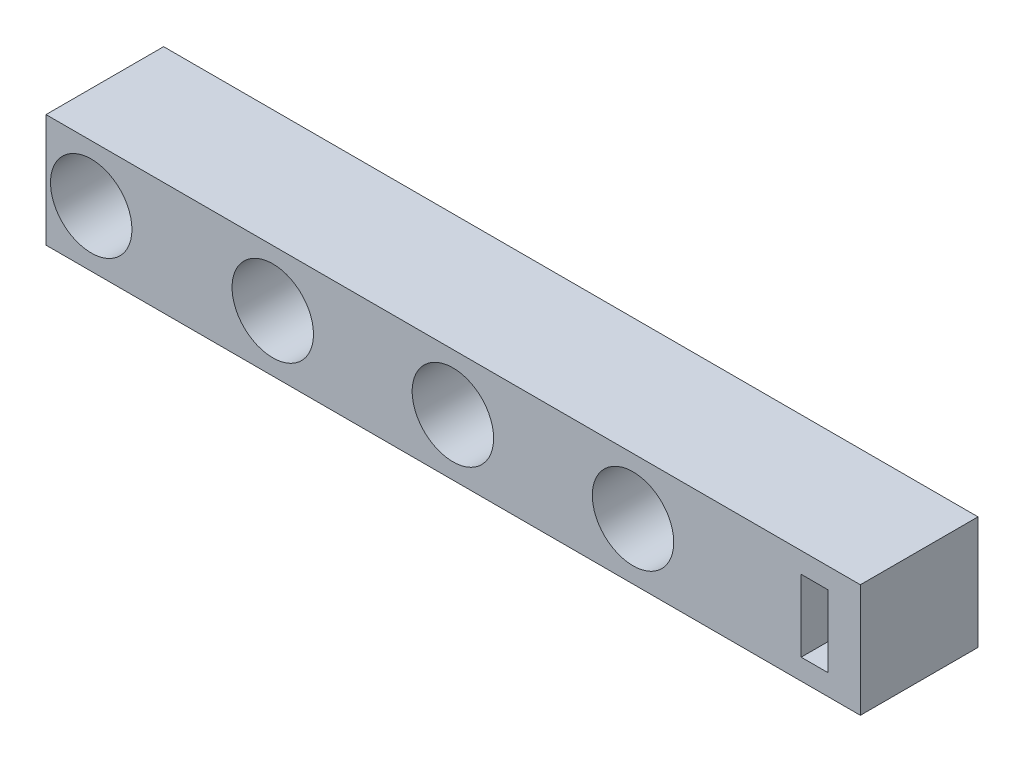
ISO-10303-21;
HEADER;
FILE_DESCRIPTION(('STEP AP214'),'2;1');
FILE_NAME('part.step','',(''),(''),'','','');
FILE_SCHEMA(('AUTOMOTIVE_DESIGN { 1 0 10303 214 1 1 1 1 }'));
ENDSEC;
DATA;
#1=APPLICATION_CONTEXT('core data for automotive mechanical design processes');
#2=APPLICATION_PROTOCOL_DEFINITION('international standard','automotive_design',2000,#1);
#3=PRODUCT_CONTEXT('',#1,'mechanical');
#4=PRODUCT('Part','Part','',(#3));
#5=PRODUCT_RELATED_PRODUCT_CATEGORY('part','',(#4));
#6=PRODUCT_DEFINITION_FORMATION('','',#4);
#7=PRODUCT_DEFINITION_CONTEXT('part definition',#1,'design');
#8=PRODUCT_DEFINITION('design','',#6,#7);
#9=PRODUCT_DEFINITION_SHAPE('','',#8);
#10=(LENGTH_UNIT() NAMED_UNIT(*) SI_UNIT(.MILLI.,.METRE.));
#11=(NAMED_UNIT(*) PLANE_ANGLE_UNIT() SI_UNIT($,.RADIAN.));
#12=(NAMED_UNIT(*) SI_UNIT($,.STERADIAN.) SOLID_ANGLE_UNIT());
#13=UNCERTAINTY_MEASURE_WITH_UNIT(LENGTH_MEASURE(1.E-05),#10,'distance_accuracy_value','');
#14=(GEOMETRIC_REPRESENTATION_CONTEXT(3) GLOBAL_UNCERTAINTY_ASSIGNED_CONTEXT((#13)) GLOBAL_UNIT_ASSIGNED_CONTEXT((#10,
#11,#12)) REPRESENTATION_CONTEXT('',''));
#15=CARTESIAN_POINT('',(0.,0.,0.));
#16=DIRECTION('',(0.,0.,1.));
#17=DIRECTION('',(1.,0.,0.));
#18=AXIS2_PLACEMENT_3D('',#15,#16,#17);
#19=CARTESIAN_POINT('',(0.,0.,26.));
#20=DIRECTION('',(1.,0.,0.));
#21=DIRECTION('',(0.,0.,-1.));
#22=AXIS2_PLACEMENT_3D('',#19,#20,#21);
#23=PLANE('',#22);
#24=DIRECTION('',(0.,-1.,0.));
#25=VECTOR('',#24,1.);
#26=CARTESIAN_POINT('',(0.,0.,0.));
#27=LINE('',#26,#25);
#28=CARTESIAN_POINT('',(0.,25.,0.));
#29=VERTEX_POINT('',#28);
#30=CARTESIAN_POINT('',(0.,0.,0.));
#31=VERTEX_POINT('',#30);
#32=EDGE_CURVE('E157',#29,#31,#27,.T.);
#33=ORIENTED_EDGE('',*,*,#32,.T.);
#34=DIRECTION('',(0.,0.,-1.));
#35=VECTOR('',#34,1.);
#36=CARTESIAN_POINT('',(0.,0.,26.));
#37=LINE('',#36,#35);
#38=CARTESIAN_POINT('',(0.,0.,26.));
#39=VERTEX_POINT('',#38);
#40=EDGE_CURVE('E11',#39,#31,#37,.T.);
#41=ORIENTED_EDGE('',*,*,#40,.F.);
#42=DIRECTION('',(0.,-1.,0.));
#43=VECTOR('',#42,1.);
#44=CARTESIAN_POINT('',(0.,0.,26.));
#45=LINE('',#44,#43);
#46=CARTESIAN_POINT('',(0.,25.,26.));
#47=VERTEX_POINT('',#46);
#48=EDGE_CURVE('E158',#47,#39,#45,.T.);
#49=ORIENTED_EDGE('',*,*,#48,.F.);
#50=DIRECTION('',(0.,0.,-1.));
#51=VECTOR('',#50,1.);
#52=CARTESIAN_POINT('',(0.,25.,26.));
#53=LINE('',#52,#51);
#54=EDGE_CURVE('E168',#47,#29,#53,.T.);
#55=ORIENTED_EDGE('',*,*,#54,.T.);
#56=EDGE_LOOP('',(#33,#41,#49,#55));
#57=FACE_BOUND('',#56,.T.);
#58=ADVANCED_FACE('F33',(#57),#23,.F.);
#59=CARTESIAN_POINT('',(0.,0.,26.));
#60=DIRECTION('',(0.,1.,0.));
#61=DIRECTION('',(0.,0.,1.));
#62=AXIS2_PLACEMENT_3D('',#59,#60,#61);
#63=PLANE('',#62);
#64=DIRECTION('',(1.,0.,0.));
#65=VECTOR('',#64,1.);
#66=CARTESIAN_POINT('',(0.,0.,0.));
#67=LINE('',#66,#65);
#68=CARTESIAN_POINT('',(180.,0.,0.));
#69=VERTEX_POINT('',#68);
#70=EDGE_CURVE('E171',#31,#69,#67,.T.);
#71=ORIENTED_EDGE('',*,*,#70,.T.);
#72=DIRECTION('',(0.,0.,-1.));
#73=VECTOR('',#72,1.);
#74=CARTESIAN_POINT('',(180.,0.,26.));
#75=LINE('',#74,#73);
#76=CARTESIAN_POINT('',(180.,0.,26.));
#77=VERTEX_POINT('',#76);
#78=EDGE_CURVE('E40',#77,#69,#75,.T.);
#79=ORIENTED_EDGE('',*,*,#78,.F.);
#80=DIRECTION('',(1.,0.,0.));
#81=VECTOR('',#80,1.);
#82=CARTESIAN_POINT('',(0.,0.,26.));
#83=LINE('',#82,#81);
#84=EDGE_CURVE('E161',#39,#77,#83,.T.);
#85=ORIENTED_EDGE('',*,*,#84,.F.);
#86=ORIENTED_EDGE('',*,*,#40,.T.);
#87=EDGE_LOOP('',(#71,#79,#85,#86));
#88=FACE_BOUND('',#87,.T.);
#89=ADVANCED_FACE('F200',(#88),#63,.F.);
#90=CARTESIAN_POINT('',(180.,0.,26.));
#91=DIRECTION('',(-1.,0.,0.));
#92=DIRECTION('',(0.,0.,1.));
#93=AXIS2_PLACEMENT_3D('',#90,#91,#92);
#94=PLANE('',#93);
#95=DIRECTION('',(0.,1.,0.));
#96=VECTOR('',#95,1.);
#97=CARTESIAN_POINT('',(180.,0.,0.));
#98=LINE('',#97,#96);
#99=CARTESIAN_POINT('',(180.,25.,0.));
#100=VERTEX_POINT('',#99);
#101=EDGE_CURVE('E173',#69,#100,#98,.T.);
#102=ORIENTED_EDGE('',*,*,#101,.T.);
#103=DIRECTION('',(0.,0.,-1.));
#104=VECTOR('',#103,1.);
#105=CARTESIAN_POINT('',(180.,25.,26.));
#106=LINE('',#105,#104);
#107=CARTESIAN_POINT('',(180.,25.,26.));
#108=VERTEX_POINT('',#107);
#109=EDGE_CURVE('E178',#108,#100,#106,.T.);
#110=ORIENTED_EDGE('',*,*,#109,.F.);
#111=DIRECTION('',(0.,1.,0.));
#112=VECTOR('',#111,1.);
#113=CARTESIAN_POINT('',(180.,0.,26.));
#114=LINE('',#113,#112);
#115=EDGE_CURVE('E164',#77,#108,#114,.T.);
#116=ORIENTED_EDGE('',*,*,#115,.F.);
#117=ORIENTED_EDGE('',*,*,#78,.T.);
#118=EDGE_LOOP('',(#102,#110,#116,#117));
#119=FACE_BOUND('',#118,.T.);
#120=ADVANCED_FACE('F185',(#119),#94,.F.);
#121=CARTESIAN_POINT('',(0.,25.,26.));
#122=DIRECTION('',(0.,-1.,0.));
#123=DIRECTION('',(0.,0.,-1.));
#124=AXIS2_PLACEMENT_3D('',#121,#122,#123);
#125=PLANE('',#124);
#126=DIRECTION('',(-1.,0.,0.));
#127=VECTOR('',#126,1.);
#128=CARTESIAN_POINT('',(0.,25.,0.));
#129=LINE('',#128,#127);
#130=EDGE_CURVE('E162',#100,#29,#129,.T.);
#131=ORIENTED_EDGE('',*,*,#130,.T.);
#132=ORIENTED_EDGE('',*,*,#54,.F.);
#133=DIRECTION('',(-1.,0.,0.));
#134=VECTOR('',#133,1.);
#135=CARTESIAN_POINT('',(0.,25.,26.));
#136=LINE('',#135,#134);
#137=EDGE_CURVE('E166',#108,#47,#136,.T.);
#138=ORIENTED_EDGE('',*,*,#137,.F.);
#139=ORIENTED_EDGE('',*,*,#109,.T.);
#140=EDGE_LOOP('',(#131,#132,#138,#139));
#141=FACE_BOUND('',#140,.T.);
#142=ADVANCED_FACE('F193',(#141),#125,.F.);
#143=CARTESIAN_POINT('',(0.,0.,26.));
#144=DIRECTION('',(0.,0.,-1.));
#145=DIRECTION('',(-1.,0.,0.));
#146=AXIS2_PLACEMENT_3D('',#143,#144,#145);
#147=PLANE('',#146);
#148=DIRECTION('',(-1.,0.,0.));
#149=VECTOR('',#148,1.);
#150=CARTESIAN_POINT('',(172.810723890188,20.4582947622352,26.));
#151=LINE('',#150,#149);
#152=CARTESIAN_POINT('',(172.810723890188,20.4582947622352,26.));
#153=VERTEX_POINT('',#152);
#154=CARTESIAN_POINT('',(166.913142675889,20.4582947622352,26.));
#155=VERTEX_POINT('',#154);
#156=EDGE_CURVE('E124',#153,#155,#151,.T.);
#157=ORIENTED_EDGE('',*,*,#156,.F.);
#158=DIRECTION('',(0.,1.,0.));
#159=VECTOR('',#158,1.);
#160=CARTESIAN_POINT('',(172.810723890188,20.4582947622352,26.));
#161=LINE('',#160,#159);
#162=CARTESIAN_POINT('',(172.810723890188,4.59099292376435,26.));
#163=VERTEX_POINT('',#162);
#164=EDGE_CURVE('E47',#163,#153,#161,.T.);
#165=ORIENTED_EDGE('',*,*,#164,.F.);
#166=DIRECTION('',(1.,0.,0.));
#167=VECTOR('',#166,1.);
#168=CARTESIAN_POINT('',(172.810723890188,4.59099292376435,26.));
#169=LINE('',#168,#167);
#170=CARTESIAN_POINT('',(166.913142675889,4.59099292376435,26.));
#171=VERTEX_POINT('',#170);
#172=EDGE_CURVE('E115',#171,#163,#169,.T.);
#173=ORIENTED_EDGE('',*,*,#172,.F.);
#174=DIRECTION('',(0.,-1.,0.));
#175=VECTOR('',#174,1.);
#176=CARTESIAN_POINT('',(166.913142675889,20.4582947622352,26.));
#177=LINE('',#176,#175);
#178=EDGE_CURVE('E118',#155,#171,#177,.T.);
#179=ORIENTED_EDGE('',*,*,#178,.F.);
#180=EDGE_LOOP('',(#157,#165,#173,#179));
#181=FACE_BOUND('',#180,.T.);
#182=CARTESIAN_POINT('',(9.99561826907186,12.5,26.));
#183=DIRECTION('',(0.,0.,1.));
#184=DIRECTION('',(1.,0.,0.));
#185=AXIS2_PLACEMENT_3D('',#182,#183,#184);
#186=CIRCLE('',#185,8.99999999999999);
#187=CARTESIAN_POINT('',(18.9956182690718,12.5,26.));
#188=VERTEX_POINT('',#187);
#189=EDGE_CURVE('E130',#188,#188,#186,.T.);
#190=ORIENTED_EDGE('',*,*,#189,.F.);
#191=EDGE_LOOP('',(#190));
#192=FACE_BOUND('',#191,.T.);
#193=CARTESIAN_POINT('',(50.1213030261893,12.5,26.));
#194=DIRECTION('',(0.,0.,1.));
#195=DIRECTION('',(1.,0.,0.));
#196=AXIS2_PLACEMENT_3D('',#193,#194,#195);
#197=CIRCLE('',#196,8.99999999999999);
#198=CARTESIAN_POINT('',(59.1213030261892,12.5,26.));
#199=VERTEX_POINT('',#198);
#200=EDGE_CURVE('E139',#199,#199,#197,.T.);
#201=ORIENTED_EDGE('',*,*,#200,.F.);
#202=EDGE_LOOP('',(#201));
#203=FACE_BOUND('',#202,.T.);
#204=CARTESIAN_POINT('',(89.934725645119,12.5,26.));
#205=DIRECTION('',(0.,0.,1.));
#206=DIRECTION('',(1.,0.,0.));
#207=AXIS2_PLACEMENT_3D('',#204,#205,#206);
#208=CIRCLE('',#207,8.99999999999999);
#209=CARTESIAN_POINT('',(98.934725645119,12.5,26.));
#210=VERTEX_POINT('',#209);
#211=EDGE_CURVE('E145',#210,#210,#208,.T.);
#212=ORIENTED_EDGE('',*,*,#211,.F.);
#213=EDGE_LOOP('',(#212));
#214=FACE_BOUND('',#213,.T.);
#215=CARTESIAN_POINT('',(129.748148264049,12.5,26.));
#216=DIRECTION('',(0.,0.,1.));
#217=DIRECTION('',(1.,0.,0.));
#218=AXIS2_PLACEMENT_3D('',#215,#216,#217);
#219=CIRCLE('',#218,8.99999999999998);
#220=CARTESIAN_POINT('',(138.748148264049,12.5,26.));
#221=VERTEX_POINT('',#220);
#222=EDGE_CURVE('E151',#221,#221,#219,.T.);
#223=ORIENTED_EDGE('',*,*,#222,.F.);
#224=EDGE_LOOP('',(#223));
#225=FACE_BOUND('',#224,.T.);
#226=ORIENTED_EDGE('',*,*,#48,.T.);
#227=ORIENTED_EDGE('',*,*,#84,.T.);
#228=ORIENTED_EDGE('',*,*,#115,.T.);
#229=ORIENTED_EDGE('',*,*,#137,.T.);
#230=EDGE_LOOP('',(#226,#227,#228,#229));
#231=FACE_BOUND('',#230,.T.);
#232=ADVANCED_FACE('F199',(#181,#192,#203,#214,#225,#231),#147,.F.);
#233=CARTESIAN_POINT('',(0.,0.,0.));
#234=DIRECTION('',(0.,0.,-1.));
#235=DIRECTION('',(-1.,0.,0.));
#236=AXIS2_PLACEMENT_3D('',#233,#234,#235);
#237=PLANE('',#236);
#238=DIRECTION('',(0.,1.,0.));
#239=VECTOR('',#238,1.);
#240=CARTESIAN_POINT('',(172.810723890188,20.4582947622352,0.));
#241=LINE('',#240,#239);
#242=CARTESIAN_POINT('',(172.810723890188,4.59099292376435,0.));
#243=VERTEX_POINT('',#242);
#244=CARTESIAN_POINT('',(172.810723890188,20.4582947622352,0.));
#245=VERTEX_POINT('',#244);
#246=EDGE_CURVE('E99',#243,#245,#241,.T.);
#247=ORIENTED_EDGE('',*,*,#246,.T.);
#248=DIRECTION('',(-1.,0.,0.));
#249=VECTOR('',#248,1.);
#250=CARTESIAN_POINT('',(172.810723890188,20.4582947622352,0.));
#251=LINE('',#250,#249);
#252=CARTESIAN_POINT('',(166.913142675889,20.4582947622352,0.));
#253=VERTEX_POINT('',#252);
#254=EDGE_CURVE('E108',#245,#253,#251,.T.);
#255=ORIENTED_EDGE('',*,*,#254,.T.);
#256=DIRECTION('',(0.,-1.,0.));
#257=VECTOR('',#256,1.);
#258=CARTESIAN_POINT('',(166.913142675889,20.4582947622352,0.));
#259=LINE('',#258,#257);
#260=CARTESIAN_POINT('',(166.913142675889,4.59099292376435,0.));
#261=VERTEX_POINT('',#260);
#262=EDGE_CURVE('E55',#253,#261,#259,.T.);
#263=ORIENTED_EDGE('',*,*,#262,.T.);
#264=DIRECTION('',(1.,0.,0.));
#265=VECTOR('',#264,1.);
#266=CARTESIAN_POINT('',(172.810723890188,4.59099292376435,0.));
#267=LINE('',#266,#265);
#268=EDGE_CURVE('E105',#261,#243,#267,.T.);
#269=ORIENTED_EDGE('',*,*,#268,.T.);
#270=EDGE_LOOP('',(#247,#255,#263,#269));
#271=FACE_BOUND('',#270,.T.);
#272=CARTESIAN_POINT('',(9.99561826907186,12.5,0.));
#273=DIRECTION('',(0.,0.,1.));
#274=DIRECTION('',(1.,0.,0.));
#275=AXIS2_PLACEMENT_3D('',#272,#273,#274);
#276=CIRCLE('',#275,8.99999999999999);
#277=CARTESIAN_POINT('',(18.9956182690718,12.5,0.));
#278=VERTEX_POINT('',#277);
#279=EDGE_CURVE('E136',#278,#278,#276,.T.);
#280=ORIENTED_EDGE('',*,*,#279,.T.);
#281=EDGE_LOOP('',(#280));
#282=FACE_BOUND('',#281,.T.);
#283=CARTESIAN_POINT('',(50.1213030261893,12.5,0.));
#284=DIRECTION('',(0.,0.,1.));
#285=DIRECTION('',(1.,0.,0.));
#286=AXIS2_PLACEMENT_3D('',#283,#284,#285);
#287=CIRCLE('',#286,8.99999999999999);
#288=CARTESIAN_POINT('',(59.1213030261892,12.5,0.));
#289=VERTEX_POINT('',#288);
#290=EDGE_CURVE('E142',#289,#289,#287,.T.);
#291=ORIENTED_EDGE('',*,*,#290,.T.);
#292=EDGE_LOOP('',(#291));
#293=FACE_BOUND('',#292,.T.);
#294=CARTESIAN_POINT('',(89.934725645119,12.5,0.));
#295=DIRECTION('',(0.,0.,1.));
#296=DIRECTION('',(1.,0.,0.));
#297=AXIS2_PLACEMENT_3D('',#294,#295,#296);
#298=CIRCLE('',#297,8.99999999999998);
#299=CARTESIAN_POINT('',(98.934725645119,12.5,0.));
#300=VERTEX_POINT('',#299);
#301=EDGE_CURVE('E148',#300,#300,#298,.T.);
#302=ORIENTED_EDGE('',*,*,#301,.T.);
#303=EDGE_LOOP('',(#302));
#304=FACE_BOUND('',#303,.T.);
#305=CARTESIAN_POINT('',(129.748148264049,12.5,0.));
#306=DIRECTION('',(0.,0.,1.));
#307=DIRECTION('',(1.,0.,0.));
#308=AXIS2_PLACEMENT_3D('',#305,#306,#307);
#309=CIRCLE('',#308,8.99999999999998);
#310=CARTESIAN_POINT('',(138.748148264049,12.5,0.));
#311=VERTEX_POINT('',#310);
#312=EDGE_CURVE('E154',#311,#311,#309,.T.);
#313=ORIENTED_EDGE('',*,*,#312,.T.);
#314=EDGE_LOOP('',(#313));
#315=FACE_BOUND('',#314,.T.);
#316=ORIENTED_EDGE('',*,*,#32,.F.);
#317=ORIENTED_EDGE('',*,*,#130,.F.);
#318=ORIENTED_EDGE('',*,*,#101,.F.);
#319=ORIENTED_EDGE('',*,*,#70,.F.);
#320=EDGE_LOOP('',(#316,#317,#318,#319));
#321=FACE_BOUND('',#320,.T.);
#322=ADVANCED_FACE('F112',(#271,#282,#293,#304,#315,#321),#237,.T.);
#323=CARTESIAN_POINT('',(129.748148264049,12.5,26.));
#324=DIRECTION('',(0.,0.,1.));
#325=DIRECTION('',(1.,0.,0.));
#326=AXIS2_PLACEMENT_3D('',#323,#324,#325);
#327=CYLINDRICAL_SURFACE('',#326,8.99999999999998);
#328=ORIENTED_EDGE('',*,*,#312,.F.);
#329=EDGE_LOOP('',(#328));
#330=FACE_BOUND('',#329,.T.);
#331=ORIENTED_EDGE('',*,*,#222,.T.);
#332=EDGE_LOOP('',(#331));
#333=FACE_BOUND('',#332,.T.);
#334=ADVANCED_FACE('F212',(#330,#333),#327,.F.);
#335=CARTESIAN_POINT('',(89.934725645119,12.5,26.));
#336=DIRECTION('',(0.,0.,1.));
#337=DIRECTION('',(1.,0.,0.));
#338=AXIS2_PLACEMENT_3D('',#335,#336,#337);
#339=CYLINDRICAL_SURFACE('',#338,8.99999999999999);
#340=ORIENTED_EDGE('',*,*,#301,.F.);
#341=EDGE_LOOP('',(#340));
#342=FACE_BOUND('',#341,.T.);
#343=ORIENTED_EDGE('',*,*,#211,.T.);
#344=EDGE_LOOP('',(#343));
#345=FACE_BOUND('',#344,.T.);
#346=ADVANCED_FACE('F218',(#342,#345),#339,.F.);
#347=CARTESIAN_POINT('',(50.1213030261893,12.5,26.));
#348=DIRECTION('',(0.,0.,1.));
#349=DIRECTION('',(1.,0.,0.));
#350=AXIS2_PLACEMENT_3D('',#347,#348,#349);
#351=CYLINDRICAL_SURFACE('',#350,8.99999999999999);
#352=ORIENTED_EDGE('',*,*,#290,.F.);
#353=EDGE_LOOP('',(#352));
#354=FACE_BOUND('',#353,.T.);
#355=ORIENTED_EDGE('',*,*,#200,.T.);
#356=EDGE_LOOP('',(#355));
#357=FACE_BOUND('',#356,.T.);
#358=ADVANCED_FACE('F222',(#354,#357),#351,.F.);
#359=CARTESIAN_POINT('',(9.99561826907186,12.5,26.));
#360=DIRECTION('',(0.,0.,1.));
#361=DIRECTION('',(1.,0.,0.));
#362=AXIS2_PLACEMENT_3D('',#359,#360,#361);
#363=CYLINDRICAL_SURFACE('',#362,8.99999999999999);
#364=ORIENTED_EDGE('',*,*,#279,.F.);
#365=EDGE_LOOP('',(#364));
#366=FACE_BOUND('',#365,.T.);
#367=ORIENTED_EDGE('',*,*,#189,.T.);
#368=EDGE_LOOP('',(#367));
#369=FACE_BOUND('',#368,.T.);
#370=ADVANCED_FACE('F226',(#366,#369),#363,.F.);
#371=CARTESIAN_POINT('',(172.810723890188,20.4582947622352,0.));
#372=DIRECTION('',(1.,0.,0.));
#373=DIRECTION('',(0.,0.,-1.));
#374=AXIS2_PLACEMENT_3D('',#371,#372,#373);
#375=PLANE('',#374);
#376=ORIENTED_EDGE('',*,*,#164,.T.);
#377=DIRECTION('',(0.,0.,1.));
#378=VECTOR('',#377,1.);
#379=CARTESIAN_POINT('',(172.810723890188,20.4582947622352,0.));
#380=LINE('',#379,#378);
#381=EDGE_CURVE('E95',#245,#153,#380,.T.);
#382=ORIENTED_EDGE('',*,*,#381,.F.);
#383=ORIENTED_EDGE('',*,*,#246,.F.);
#384=DIRECTION('',(0.,0.,1.));
#385=VECTOR('',#384,1.);
#386=CARTESIAN_POINT('',(172.810723890188,4.59099292376435,0.));
#387=LINE('',#386,#385);
#388=EDGE_CURVE('E128',#243,#163,#387,.T.);
#389=ORIENTED_EDGE('',*,*,#388,.T.);
#390=EDGE_LOOP('',(#376,#382,#383,#389));
#391=FACE_BOUND('',#390,.T.);
#392=ADVANCED_FACE('F97',(#391),#375,.F.);
#393=CARTESIAN_POINT('',(172.810723890188,4.59099292376435,0.));
#394=DIRECTION('',(0.,-1.,0.));
#395=DIRECTION('',(0.,0.,-1.));
#396=AXIS2_PLACEMENT_3D('',#393,#394,#395);
#397=PLANE('',#396);
#398=ORIENTED_EDGE('',*,*,#172,.T.);
#399=ORIENTED_EDGE('',*,*,#388,.F.);
#400=ORIENTED_EDGE('',*,*,#268,.F.);
#401=DIRECTION('',(0.,0.,1.));
#402=VECTOR('',#401,1.);
#403=CARTESIAN_POINT('',(166.913142675889,4.59099292376435,0.));
#404=LINE('',#403,#402);
#405=EDGE_CURVE('E131',#261,#171,#404,.T.);
#406=ORIENTED_EDGE('',*,*,#405,.T.);
#407=EDGE_LOOP('',(#398,#399,#400,#406));
#408=FACE_BOUND('',#407,.T.);
#409=ADVANCED_FACE('F233',(#408),#397,.F.);
#410=CARTESIAN_POINT('',(166.913142675889,20.4582947622352,0.));
#411=DIRECTION('',(-1.,0.,0.));
#412=DIRECTION('',(0.,0.,1.));
#413=AXIS2_PLACEMENT_3D('',#410,#411,#412);
#414=PLANE('',#413);
#415=ORIENTED_EDGE('',*,*,#178,.T.);
#416=ORIENTED_EDGE('',*,*,#405,.F.);
#417=ORIENTED_EDGE('',*,*,#262,.F.);
#418=DIRECTION('',(0.,0.,1.));
#419=VECTOR('',#418,1.);
#420=CARTESIAN_POINT('',(166.913142675889,20.4582947622352,0.));
#421=LINE('',#420,#419);
#422=EDGE_CURVE('E104',#253,#155,#421,.T.);
#423=ORIENTED_EDGE('',*,*,#422,.T.);
#424=EDGE_LOOP('',(#415,#416,#417,#423));
#425=FACE_BOUND('',#424,.T.);
#426=ADVANCED_FACE('F236',(#425),#414,.F.);
#427=CARTESIAN_POINT('',(172.810723890188,20.4582947622352,0.));
#428=DIRECTION('',(0.,1.,0.));
#429=DIRECTION('',(0.,0.,1.));
#430=AXIS2_PLACEMENT_3D('',#427,#428,#429);
#431=PLANE('',#430);
#432=ORIENTED_EDGE('',*,*,#156,.T.);
#433=ORIENTED_EDGE('',*,*,#422,.F.);
#434=ORIENTED_EDGE('',*,*,#254,.F.);
#435=ORIENTED_EDGE('',*,*,#381,.T.);
#436=EDGE_LOOP('',(#432,#433,#434,#435));
#437=FACE_BOUND('',#436,.T.);
#438=ADVANCED_FACE('F109',(#437),#431,.F.);
#439=CLOSED_SHELL('',(#58,#89,#120,#142,#232,#322,#334,#346,#358,#370,#392,#409,#426,#438));
#440=MANIFOLD_SOLID_BREP('B2',#439);
#441=ADVANCED_BREP_SHAPE_REPRESENTATION('',(#18,#440),#14);
#442=SHAPE_DEFINITION_REPRESENTATION(#9,#441);
ENDSEC;
END-ISO-10303-21;
